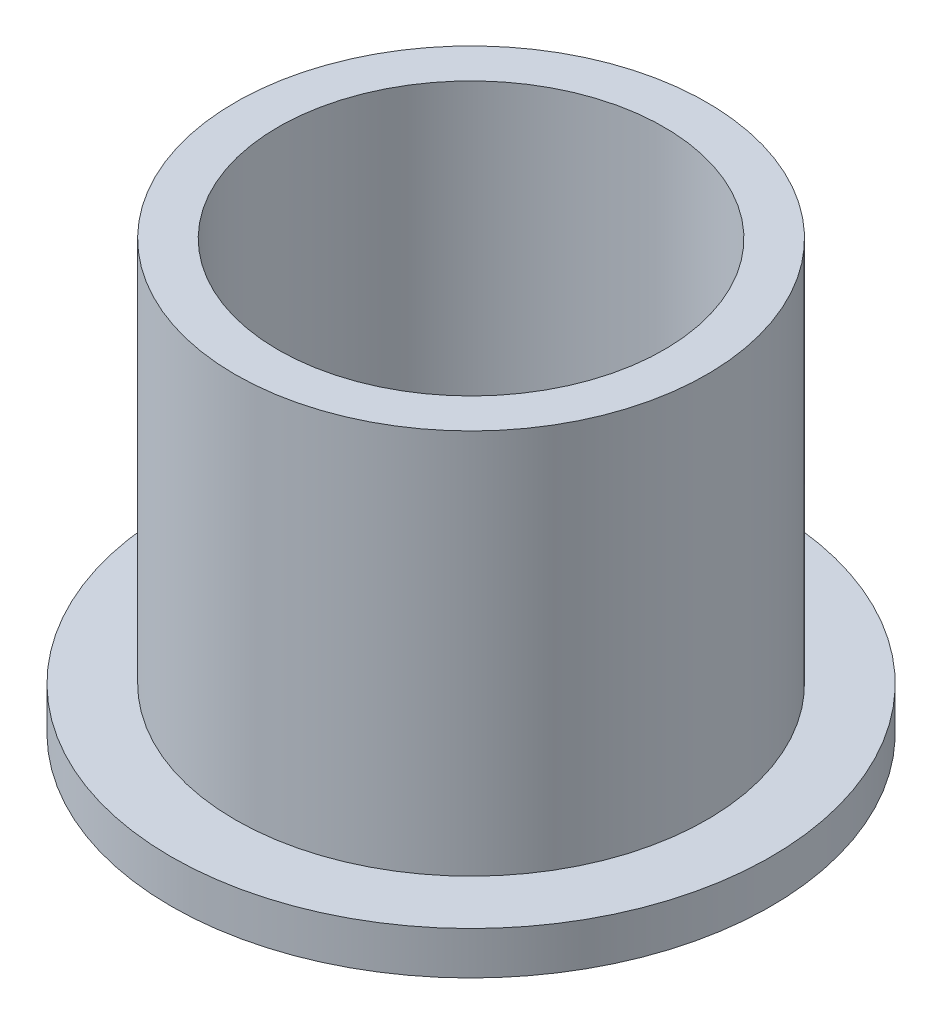
ISO-10303-21;
HEADER;
FILE_DESCRIPTION(('STEP AP214'),'2;1');
FILE_NAME('part.step','',(''),(''),'','','');
FILE_SCHEMA(('AUTOMOTIVE_DESIGN { 1 0 10303 214 1 1 1 1 }'));
ENDSEC;
DATA;
#1=APPLICATION_CONTEXT('core data for automotive mechanical design processes');
#2=APPLICATION_PROTOCOL_DEFINITION('international standard','automotive_design',2000,#1);
#3=PRODUCT_CONTEXT('',#1,'mechanical');
#4=PRODUCT('Part','Part','',(#3));
#5=PRODUCT_RELATED_PRODUCT_CATEGORY('part','',(#4));
#6=PRODUCT_DEFINITION_FORMATION('','',#4);
#7=PRODUCT_DEFINITION_CONTEXT('part definition',#1,'design');
#8=PRODUCT_DEFINITION('design','',#6,#7);
#9=PRODUCT_DEFINITION_SHAPE('','',#8);
#10=(LENGTH_UNIT() NAMED_UNIT(*) SI_UNIT(.MILLI.,.METRE.));
#11=(NAMED_UNIT(*) PLANE_ANGLE_UNIT() SI_UNIT($,.RADIAN.));
#12=(NAMED_UNIT(*) SI_UNIT($,.STERADIAN.) SOLID_ANGLE_UNIT());
#13=UNCERTAINTY_MEASURE_WITH_UNIT(LENGTH_MEASURE(1.E-05),#10,'distance_accuracy_value','');
#14=(GEOMETRIC_REPRESENTATION_CONTEXT(3) GLOBAL_UNCERTAINTY_ASSIGNED_CONTEXT((#13)) GLOBAL_UNIT_ASSIGNED_CONTEXT((#10,
#11,#12)) REPRESENTATION_CONTEXT('',''));
#15=CARTESIAN_POINT('',(0.,0.,0.));
#16=DIRECTION('',(0.,0.,1.));
#17=DIRECTION('',(1.,0.,0.));
#18=AXIS2_PLACEMENT_3D('',#15,#16,#17);
#19=CARTESIAN_POINT('',(0.,31.75,0.));
#20=DIRECTION('',(0.,1.,0.));
#21=DIRECTION('',(0.,0.,1.));
#22=AXIS2_PLACEMENT_3D('',#19,#20,#21);
#23=PLANE('',#22);
#24=CARTESIAN_POINT('',(0.,31.75,0.));
#25=DIRECTION('',(0.,1.,0.));
#26=DIRECTION('',(0.,0.,1.));
#27=AXIS2_PLACEMENT_3D('',#24,#25,#26);
#28=CIRCLE('',#27,17.4752);
#29=CARTESIAN_POINT('',(0.,31.75,17.4752));
#30=VERTEX_POINT('',#29);
#31=EDGE_CURVE('E10',#30,#30,#28,.T.);
#32=ORIENTED_EDGE('',*,*,#31,.T.);
#33=EDGE_LOOP('',(#32));
#34=FACE_BOUND('',#33,.T.);
#35=CARTESIAN_POINT('',(0.,31.75,0.));
#36=DIRECTION('',(0.,1.,0.));
#37=DIRECTION('',(0.,0.,1.));
#38=AXIS2_PLACEMENT_3D('',#35,#36,#37);
#39=CIRCLE('',#38,14.3002);
#40=CARTESIAN_POINT('',(0.,31.75,14.3002));
#41=VERTEX_POINT('',#40);
#42=EDGE_CURVE('E42',#41,#41,#39,.T.);
#43=ORIENTED_EDGE('',*,*,#42,.F.);
#44=EDGE_LOOP('',(#43));
#45=FACE_BOUND('',#44,.T.);
#46=ADVANCED_FACE('F35',(#34,#45),#23,.T.);
#47=CARTESIAN_POINT('',(0.,0.,0.));
#48=DIRECTION('',(0.,1.,0.));
#49=DIRECTION('',(0.,0.,1.));
#50=AXIS2_PLACEMENT_3D('',#47,#48,#49);
#51=PLANE('',#50);
#52=CARTESIAN_POINT('',(0.,0.,0.));
#53=DIRECTION('',(0.,1.,0.));
#54=DIRECTION('',(0.,0.,1.));
#55=AXIS2_PLACEMENT_3D('',#52,#53,#54);
#56=CIRCLE('',#55,14.3002);
#57=CARTESIAN_POINT('',(0.,0.,14.3002));
#58=VERTEX_POINT('',#57);
#59=EDGE_CURVE('E46',#58,#58,#56,.T.);
#60=ORIENTED_EDGE('',*,*,#59,.T.);
#61=EDGE_LOOP('',(#60));
#62=FACE_BOUND('',#61,.T.);
#63=CARTESIAN_POINT('',(0.,0.,0.));
#64=DIRECTION('',(0.,1.,0.));
#65=DIRECTION('',(0.,0.,1.));
#66=AXIS2_PLACEMENT_3D('',#63,#64,#65);
#67=CIRCLE('',#66,22.225);
#68=CARTESIAN_POINT('',(0.,0.,22.225));
#69=VERTEX_POINT('',#68);
#70=EDGE_CURVE('E53',#69,#69,#67,.T.);
#71=ORIENTED_EDGE('',*,*,#70,.F.);
#72=EDGE_LOOP('',(#71));
#73=FACE_BOUND('',#72,.T.);
#74=ADVANCED_FACE('F78',(#62,#73),#51,.F.);
#75=CARTESIAN_POINT('',(0.,31.75,0.));
#76=DIRECTION('',(0.,-1.,0.));
#77=DIRECTION('',(0.,0.,-1.));
#78=AXIS2_PLACEMENT_3D('',#75,#76,#77);
#79=CYLINDRICAL_SURFACE('',#78,17.4752);
#80=CARTESIAN_POINT('',(0.,3.175,0.));
#81=DIRECTION('',(0.,1.,0.));
#82=DIRECTION('',(0.,0.,1.));
#83=AXIS2_PLACEMENT_3D('',#80,#81,#82);
#84=CIRCLE('',#83,17.4752);
#85=CARTESIAN_POINT('',(0.,3.175,17.4752));
#86=VERTEX_POINT('',#85);
#87=EDGE_CURVE('E56',#86,#86,#84,.T.);
#88=ORIENTED_EDGE('',*,*,#87,.T.);
#89=EDGE_LOOP('',(#88));
#90=FACE_BOUND('',#89,.T.);
#91=ORIENTED_EDGE('',*,*,#31,.F.);
#92=EDGE_LOOP('',(#91));
#93=FACE_BOUND('',#92,.T.);
#94=ADVANCED_FACE('F37',(#90,#93),#79,.T.);
#95=CARTESIAN_POINT('',(0.,31.75,0.));
#96=DIRECTION('',(0.,-1.,0.));
#97=DIRECTION('',(0.,0.,-1.));
#98=AXIS2_PLACEMENT_3D('',#95,#96,#97);
#99=CYLINDRICAL_SURFACE('',#98,14.3002);
#100=ORIENTED_EDGE('',*,*,#42,.T.);
#101=EDGE_LOOP('',(#100));
#102=FACE_BOUND('',#101,.T.);
#103=ORIENTED_EDGE('',*,*,#59,.F.);
#104=EDGE_LOOP('',(#103));
#105=FACE_BOUND('',#104,.T.);
#106=ADVANCED_FACE('F67',(#102,#105),#99,.F.);
#107=CARTESIAN_POINT('',(0.,3.175,0.));
#108=DIRECTION('',(0.,1.,0.));
#109=DIRECTION('',(0.,0.,1.));
#110=AXIS2_PLACEMENT_3D('',#107,#108,#109);
#111=PLANE('',#110);
#112=CARTESIAN_POINT('',(0.,3.175,0.));
#113=DIRECTION('',(0.,1.,0.));
#114=DIRECTION('',(0.,0.,1.));
#115=AXIS2_PLACEMENT_3D('',#112,#113,#114);
#116=CIRCLE('',#115,22.225);
#117=CARTESIAN_POINT('',(0.,3.175,22.225));
#118=VERTEX_POINT('',#117);
#119=EDGE_CURVE('E51',#118,#118,#116,.T.);
#120=ORIENTED_EDGE('',*,*,#119,.T.);
#121=EDGE_LOOP('',(#120));
#122=FACE_BOUND('',#121,.T.);
#123=ORIENTED_EDGE('',*,*,#87,.F.);
#124=EDGE_LOOP('',(#123));
#125=FACE_BOUND('',#124,.T.);
#126=ADVANCED_FACE('F64',(#122,#125),#111,.T.);
#127=CARTESIAN_POINT('',(0.,3.175,0.));
#128=DIRECTION('',(0.,-1.,0.));
#129=DIRECTION('',(0.,0.,-1.));
#130=AXIS2_PLACEMENT_3D('',#127,#128,#129);
#131=CYLINDRICAL_SURFACE('',#130,22.225);
#132=ORIENTED_EDGE('',*,*,#119,.F.);
#133=EDGE_LOOP('',(#132));
#134=FACE_BOUND('',#133,.T.);
#135=ORIENTED_EDGE('',*,*,#70,.T.);
#136=EDGE_LOOP('',(#135));
#137=FACE_BOUND('',#136,.T.);
#138=ADVANCED_FACE('F66',(#134,#137),#131,.T.);
#139=CLOSED_SHELL('',(#46,#74,#94,#106,#126,#138));
#140=MANIFOLD_SOLID_BREP('B2',#139);
#141=ADVANCED_BREP_SHAPE_REPRESENTATION('',(#18,#140),#14);
#142=SHAPE_DEFINITION_REPRESENTATION(#9,#141);
ENDSEC;
END-ISO-10303-21;
